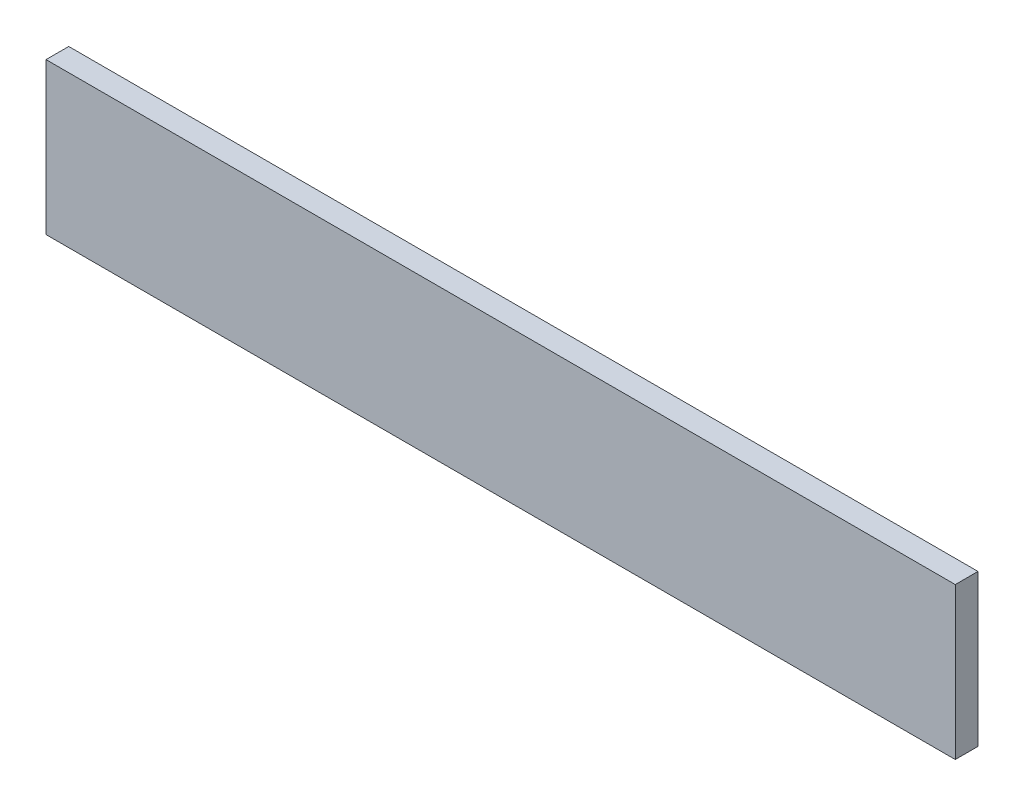
ISO-10303-21;
HEADER;
FILE_DESCRIPTION(('STEP AP214'),'2;1');
FILE_NAME('part.step','',(''),(''),'','','');
FILE_SCHEMA(('AUTOMOTIVE_DESIGN { 1 0 10303 214 1 1 1 1 }'));
ENDSEC;
DATA;
#1=APPLICATION_CONTEXT('core data for automotive mechanical design processes');
#2=APPLICATION_PROTOCOL_DEFINITION('international standard','automotive_design',2000,#1);
#3=PRODUCT_CONTEXT('',#1,'mechanical');
#4=PRODUCT('Part','Part','',(#3));
#5=PRODUCT_RELATED_PRODUCT_CATEGORY('part','',(#4));
#6=PRODUCT_DEFINITION_FORMATION('','',#4);
#7=PRODUCT_DEFINITION_CONTEXT('part definition',#1,'design');
#8=PRODUCT_DEFINITION('design','',#6,#7);
#9=PRODUCT_DEFINITION_SHAPE('','',#8);
#10=(LENGTH_UNIT() NAMED_UNIT(*) SI_UNIT(.MILLI.,.METRE.));
#11=(NAMED_UNIT(*) PLANE_ANGLE_UNIT() SI_UNIT($,.RADIAN.));
#12=(NAMED_UNIT(*) SI_UNIT($,.STERADIAN.) SOLID_ANGLE_UNIT());
#13=UNCERTAINTY_MEASURE_WITH_UNIT(LENGTH_MEASURE(1.E-05),#10,'distance_accuracy_value','');
#14=(GEOMETRIC_REPRESENTATION_CONTEXT(3) GLOBAL_UNCERTAINTY_ASSIGNED_CONTEXT((#13)) GLOBAL_UNIT_ASSIGNED_CONTEXT((#10,
#11,#12)) REPRESENTATION_CONTEXT('',''));
#15=CARTESIAN_POINT('',(0.,0.,0.));
#16=DIRECTION('',(0.,0.,1.));
#17=DIRECTION('',(1.,0.,0.));
#18=AXIS2_PLACEMENT_3D('',#15,#16,#17);
#19=CARTESIAN_POINT('',(0.,0.,6.));
#20=DIRECTION('',(-1.,0.,0.));
#21=DIRECTION('',(0.,0.,1.));
#22=AXIS2_PLACEMENT_3D('',#19,#20,#21);
#23=PLANE('',#22);
#24=DIRECTION('',(0.,1.,0.));
#25=VECTOR('',#24,1.);
#26=CARTESIAN_POINT('',(0.,0.,0.));
#27=LINE('',#26,#25);
#28=CARTESIAN_POINT('',(0.,0.,0.));
#29=VERTEX_POINT('',#28);
#30=CARTESIAN_POINT('',(0.,40.,0.));
#31=VERTEX_POINT('',#30);
#32=EDGE_CURVE('E96',#29,#31,#27,.T.);
#33=ORIENTED_EDGE('',*,*,#32,.T.);
#34=DIRECTION('',(0.,0.,-1.));
#35=VECTOR('',#34,1.);
#36=CARTESIAN_POINT('',(0.,40.,6.));
#37=LINE('',#36,#35);
#38=CARTESIAN_POINT('',(0.,40.,6.));
#39=VERTEX_POINT('',#38);
#40=EDGE_CURVE('E11',#39,#31,#37,.T.);
#41=ORIENTED_EDGE('',*,*,#40,.F.);
#42=DIRECTION('',(0.,1.,0.));
#43=VECTOR('',#42,1.);
#44=CARTESIAN_POINT('',(0.,0.,6.));
#45=LINE('',#44,#43);
#46=CARTESIAN_POINT('',(0.,0.,6.));
#47=VERTEX_POINT('',#46);
#48=EDGE_CURVE('E84',#47,#39,#45,.T.);
#49=ORIENTED_EDGE('',*,*,#48,.F.);
#50=DIRECTION('',(0.,0.,-1.));
#51=VECTOR('',#50,1.);
#52=CARTESIAN_POINT('',(0.,0.,6.));
#53=LINE('',#52,#51);
#54=EDGE_CURVE('E92',#47,#29,#53,.T.);
#55=ORIENTED_EDGE('',*,*,#54,.T.);
#56=EDGE_LOOP('',(#33,#41,#49,#55));
#57=FACE_BOUND('',#56,.T.);
#58=ADVANCED_FACE('F33',(#57),#23,.F.);
#59=CARTESIAN_POINT('',(0.,40.,6.));
#60=DIRECTION('',(0.,-1.,0.));
#61=DIRECTION('',(1.,0.,0.));
#62=AXIS2_PLACEMENT_3D('',#59,#60,#61);
#63=PLANE('',#62);
#64=DIRECTION('',(-1.,0.,0.));
#65=VECTOR('',#64,1.);
#66=CARTESIAN_POINT('',(0.,40.,0.));
#67=LINE('',#66,#65);
#68=CARTESIAN_POINT('',(-240.,40.,0.));
#69=VERTEX_POINT('',#68);
#70=EDGE_CURVE('E88',#31,#69,#67,.T.);
#71=ORIENTED_EDGE('',*,*,#70,.T.);
#72=DIRECTION('',(0.,0.,-1.));
#73=VECTOR('',#72,1.);
#74=CARTESIAN_POINT('',(-240.,40.,6.));
#75=LINE('',#74,#73);
#76=CARTESIAN_POINT('',(-240.,40.,6.));
#77=VERTEX_POINT('',#76);
#78=EDGE_CURVE('E41',#77,#69,#75,.T.);
#79=ORIENTED_EDGE('',*,*,#78,.F.);
#80=DIRECTION('',(-1.,0.,0.));
#81=VECTOR('',#80,1.);
#82=CARTESIAN_POINT('',(0.,40.,6.));
#83=LINE('',#82,#81);
#84=EDGE_CURVE('E79',#39,#77,#83,.T.);
#85=ORIENTED_EDGE('',*,*,#84,.F.);
#86=ORIENTED_EDGE('',*,*,#40,.T.);
#87=EDGE_LOOP('',(#71,#79,#85,#86));
#88=FACE_BOUND('',#87,.T.);
#89=ADVANCED_FACE('F87',(#88),#63,.F.);
#90=CARTESIAN_POINT('',(-240.,0.,6.));
#91=DIRECTION('',(1.,0.,0.));
#92=DIRECTION('',(0.,0.,-1.));
#93=AXIS2_PLACEMENT_3D('',#90,#91,#92);
#94=PLANE('',#93);
#95=DIRECTION('',(0.,-1.,0.));
#96=VECTOR('',#95,1.);
#97=CARTESIAN_POINT('',(-240.,0.,0.));
#98=LINE('',#97,#96);
#99=CARTESIAN_POINT('',(-240.,0.,0.));
#100=VERTEX_POINT('',#99);
#101=EDGE_CURVE('E66',#69,#100,#98,.T.);
#102=ORIENTED_EDGE('',*,*,#101,.T.);
#103=DIRECTION('',(0.,0.,-1.));
#104=VECTOR('',#103,1.);
#105=CARTESIAN_POINT('',(-240.,0.,6.));
#106=LINE('',#105,#104);
#107=CARTESIAN_POINT('',(-240.,0.,6.));
#108=VERTEX_POINT('',#107);
#109=EDGE_CURVE('E89',#108,#100,#106,.T.);
#110=ORIENTED_EDGE('',*,*,#109,.F.);
#111=DIRECTION('',(0.,-1.,0.));
#112=VECTOR('',#111,1.);
#113=CARTESIAN_POINT('',(-240.,0.,6.));
#114=LINE('',#113,#112);
#115=EDGE_CURVE('E82',#77,#108,#114,.T.);
#116=ORIENTED_EDGE('',*,*,#115,.F.);
#117=ORIENTED_EDGE('',*,*,#78,.T.);
#118=EDGE_LOOP('',(#102,#110,#116,#117));
#119=FACE_BOUND('',#118,.T.);
#120=ADVANCED_FACE('F90',(#119),#94,.F.);
#121=CARTESIAN_POINT('',(0.,0.,6.));
#122=DIRECTION('',(0.,1.,0.));
#123=DIRECTION('',(-1.,0.,0.));
#124=AXIS2_PLACEMENT_3D('',#121,#122,#123);
#125=PLANE('',#124);
#126=DIRECTION('',(1.,0.,0.));
#127=VECTOR('',#126,1.);
#128=CARTESIAN_POINT('',(0.,0.,0.));
#129=LINE('',#128,#127);
#130=EDGE_CURVE('E72',#100,#29,#129,.T.);
#131=ORIENTED_EDGE('',*,*,#130,.T.);
#132=ORIENTED_EDGE('',*,*,#54,.F.);
#133=DIRECTION('',(1.,0.,0.));
#134=VECTOR('',#133,1.);
#135=CARTESIAN_POINT('',(0.,0.,6.));
#136=LINE('',#135,#134);
#137=EDGE_CURVE('E49',#108,#47,#136,.T.);
#138=ORIENTED_EDGE('',*,*,#137,.F.);
#139=ORIENTED_EDGE('',*,*,#109,.T.);
#140=EDGE_LOOP('',(#131,#132,#138,#139));
#141=FACE_BOUND('',#140,.T.);
#142=ADVANCED_FACE('F103',(#141),#125,.F.);
#143=CARTESIAN_POINT('',(0.,0.,6.));
#144=DIRECTION('',(0.,0.,1.));
#145=DIRECTION('',(1.,0.,0.));
#146=AXIS2_PLACEMENT_3D('',#143,#144,#145);
#147=PLANE('',#146);
#148=ORIENTED_EDGE('',*,*,#48,.T.);
#149=ORIENTED_EDGE('',*,*,#84,.T.);
#150=ORIENTED_EDGE('',*,*,#115,.T.);
#151=ORIENTED_EDGE('',*,*,#137,.T.);
#152=EDGE_LOOP('',(#148,#149,#150,#151));
#153=FACE_BOUND('',#152,.T.);
#154=ADVANCED_FACE('F80',(#153),#147,.T.);
#155=CARTESIAN_POINT('',(0.,0.,0.));
#156=DIRECTION('',(0.,0.,1.));
#157=DIRECTION('',(1.,0.,0.));
#158=AXIS2_PLACEMENT_3D('',#155,#156,#157);
#159=PLANE('',#158);
#160=ORIENTED_EDGE('',*,*,#32,.F.);
#161=ORIENTED_EDGE('',*,*,#130,.F.);
#162=ORIENTED_EDGE('',*,*,#101,.F.);
#163=ORIENTED_EDGE('',*,*,#70,.F.);
#164=EDGE_LOOP('',(#160,#161,#162,#163));
#165=FACE_BOUND('',#164,.T.);
#166=ADVANCED_FACE('F106',(#165),#159,.F.);
#167=CLOSED_SHELL('',(#58,#89,#120,#142,#154,#166));
#168=MANIFOLD_SOLID_BREP('B2',#167);
#169=ADVANCED_BREP_SHAPE_REPRESENTATION('',(#18,#168),#14);
#170=SHAPE_DEFINITION_REPRESENTATION(#9,#169);
ENDSEC;
END-ISO-10303-21;
